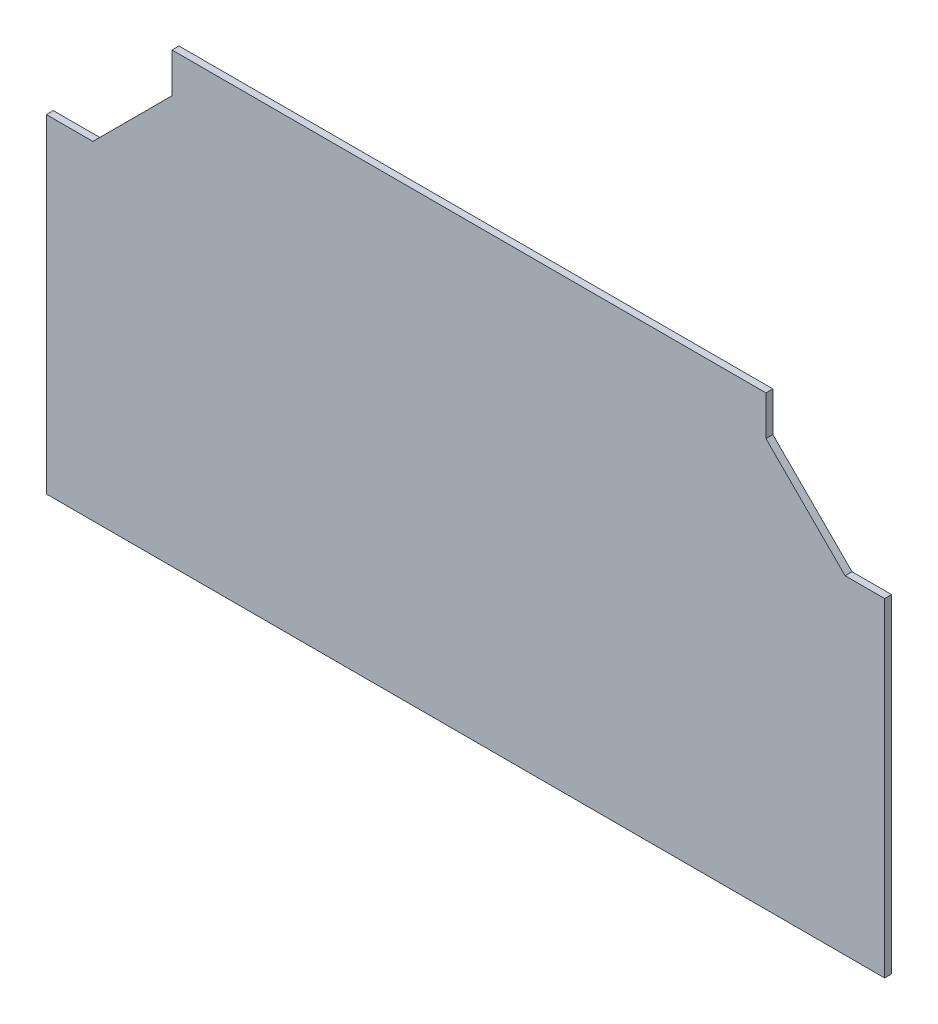
ISO-10303-21;
HEADER;
FILE_DESCRIPTION(('STEP AP214'),'2;1');
FILE_NAME('part.step','',(''),(''),'','','');
FILE_SCHEMA(('AUTOMOTIVE_DESIGN { 1 0 10303 214 1 1 1 1 }'));
ENDSEC;
DATA;
#1=APPLICATION_CONTEXT('core data for automotive mechanical design processes');
#2=APPLICATION_PROTOCOL_DEFINITION('international standard','automotive_design',2000,#1);
#3=PRODUCT_CONTEXT('',#1,'mechanical');
#4=PRODUCT('Part','Part','',(#3));
#5=PRODUCT_RELATED_PRODUCT_CATEGORY('part','',(#4));
#6=PRODUCT_DEFINITION_FORMATION('','',#4);
#7=PRODUCT_DEFINITION_CONTEXT('part definition',#1,'design');
#8=PRODUCT_DEFINITION('design','',#6,#7);
#9=PRODUCT_DEFINITION_SHAPE('','',#8);
#10=(LENGTH_UNIT() NAMED_UNIT(*) SI_UNIT(.MILLI.,.METRE.));
#11=(NAMED_UNIT(*) PLANE_ANGLE_UNIT() SI_UNIT($,.RADIAN.));
#12=(NAMED_UNIT(*) SI_UNIT($,.STERADIAN.) SOLID_ANGLE_UNIT());
#13=UNCERTAINTY_MEASURE_WITH_UNIT(LENGTH_MEASURE(1.E-05),#10,'distance_accuracy_value','');
#14=(GEOMETRIC_REPRESENTATION_CONTEXT(3) GLOBAL_UNCERTAINTY_ASSIGNED_CONTEXT((#13)) GLOBAL_UNIT_ASSIGNED_CONTEXT((#10,
#11,#12)) REPRESENTATION_CONTEXT('',''));
#15=CARTESIAN_POINT('',(0.,0.,0.));
#16=DIRECTION('',(0.,0.,1.));
#17=DIRECTION('',(1.,0.,0.));
#18=AXIS2_PLACEMENT_3D('',#15,#16,#17);
#19=CARTESIAN_POINT('',(-423.5,0.,3.5));
#20=DIRECTION('',(1.,0.,0.));
#21=DIRECTION('',(0.,0.,-1.));
#22=AXIS2_PLACEMENT_3D('',#19,#20,#21);
#23=PLANE('',#22);
#24=DIRECTION('',(0.,-1.,0.));
#25=VECTOR('',#24,1.);
#26=CARTESIAN_POINT('',(-423.5,0.,0.));
#27=LINE('',#26,#25);
#28=CARTESIAN_POINT('',(-423.5,166.,0.));
#29=VERTEX_POINT('',#28);
#30=CARTESIAN_POINT('',(-423.5,0.,0.));
#31=VERTEX_POINT('',#30);
#32=EDGE_CURVE('E141',#29,#31,#27,.T.);
#33=ORIENTED_EDGE('',*,*,#32,.T.);
#34=DIRECTION('',(0.,0.,-1.));
#35=VECTOR('',#34,1.);
#36=CARTESIAN_POINT('',(-423.5,0.,3.5));
#37=LINE('',#36,#35);
#38=CARTESIAN_POINT('',(-423.5,0.,3.5));
#39=VERTEX_POINT('',#38);
#40=EDGE_CURVE('E11',#39,#31,#37,.T.);
#41=ORIENTED_EDGE('',*,*,#40,.F.);
#42=DIRECTION('',(0.,-1.,0.));
#43=VECTOR('',#42,1.);
#44=CARTESIAN_POINT('',(-423.5,0.,3.5));
#45=LINE('',#44,#43);
#46=CARTESIAN_POINT('',(-423.5,166.,3.5));
#47=VERTEX_POINT('',#46);
#48=EDGE_CURVE('E160',#47,#39,#45,.T.);
#49=ORIENTED_EDGE('',*,*,#48,.F.);
#50=DIRECTION('',(0.,0.,-1.));
#51=VECTOR('',#50,1.);
#52=CARTESIAN_POINT('',(-423.5,166.,3.5));
#53=LINE('',#52,#51);
#54=EDGE_CURVE('E137',#47,#29,#53,.T.);
#55=ORIENTED_EDGE('',*,*,#54,.T.);
#56=EDGE_LOOP('',(#33,#41,#49,#55));
#57=FACE_BOUND('',#56,.T.);
#58=ADVANCED_FACE('F33',(#57),#23,.F.);
#59=CARTESIAN_POINT('',(-59.9999999999988,2.74806958195364E-13,3.5));
#60=DIRECTION('',(0.,1.,0.));
#61=DIRECTION('',(-1.,0.,0.));
#62=AXIS2_PLACEMENT_3D('',#59,#60,#61);
#63=PLANE('',#62);
#64=DIRECTION('',(1.,0.,0.));
#65=VECTOR('',#64,1.);
#66=CARTESIAN_POINT('',(-59.9999999999988,2.74806958195364E-13,0.));
#67=LINE('',#66,#65);
#68=CARTESIAN_POINT('',(0.,0.,0.));
#69=VERTEX_POINT('',#68);
#70=EDGE_CURVE('E144',#31,#69,#67,.T.);
#71=ORIENTED_EDGE('',*,*,#70,.T.);
#72=DIRECTION('',(0.,0.,-1.));
#73=VECTOR('',#72,1.);
#74=CARTESIAN_POINT('',(0.,0.,3.5));
#75=LINE('',#74,#73);
#76=CARTESIAN_POINT('',(0.,0.,3.5));
#77=VERTEX_POINT('',#76);
#78=EDGE_CURVE('E41',#77,#69,#75,.T.);
#79=ORIENTED_EDGE('',*,*,#78,.F.);
#80=DIRECTION('',(1.,3.02286688003802E-13,0.));
#81=VECTOR('',#80,1.);
#82=CARTESIAN_POINT('',(-420.000000000009,1.00613961606655E-12,3.5));
#83=LINE('',#82,#81);
#84=EDGE_CURVE('E98',#39,#77,#83,.T.);
#85=ORIENTED_EDGE('',*,*,#84,.F.);
#86=ORIENTED_EDGE('',*,*,#40,.T.);
#87=EDGE_LOOP('',(#71,#79,#85,#86));
#88=FACE_BOUND('',#87,.T.);
#89=ADVANCED_FACE('F181',(#88),#63,.F.);
#90=CARTESIAN_POINT('',(1.22455880881257E-12,6.00000000000029,3.5));
#91=DIRECTION('',(-1.,0.,0.));
#92=DIRECTION('',(0.,-1.,0.));
#93=AXIS2_PLACEMENT_3D('',#90,#91,#92);
#94=PLANE('',#93);
#95=DIRECTION('',(0.,1.,0.));
#96=VECTOR('',#95,1.);
#97=CARTESIAN_POINT('',(1.22455880881257E-12,6.00000000000029,0.));
#98=LINE('',#97,#96);
#99=CARTESIAN_POINT('',(0.,166.,0.));
#100=VERTEX_POINT('',#99);
#101=EDGE_CURVE('E147',#69,#100,#98,.T.);
#102=ORIENTED_EDGE('',*,*,#101,.T.);
#103=DIRECTION('',(0.,0.,-1.));
#104=VECTOR('',#103,1.);
#105=CARTESIAN_POINT('',(0.,166.,3.5));
#106=LINE('',#105,#104);
#107=CARTESIAN_POINT('',(0.,166.,3.5));
#108=VERTEX_POINT('',#107);
#109=EDGE_CURVE('E173',#108,#100,#106,.T.);
#110=ORIENTED_EDGE('',*,*,#109,.F.);
#111=DIRECTION('',(2.04093134802085E-13,1.,0.));
#112=VECTOR('',#111,1.);
#113=CARTESIAN_POINT('',(0.,0.,3.5));
#114=LINE('',#113,#112);
#115=EDGE_CURVE('E180',#77,#108,#114,.T.);
#116=ORIENTED_EDGE('',*,*,#115,.F.);
#117=ORIENTED_EDGE('',*,*,#78,.T.);
#118=EDGE_LOOP('',(#102,#110,#116,#117));
#119=FACE_BOUND('',#118,.T.);
#120=ADVANCED_FACE('F178',(#119),#94,.F.);
#121=CARTESIAN_POINT('',(0.,166.,3.5));
#122=DIRECTION('',(0.,-1.,0.));
#123=DIRECTION('',(0.,0.,-1.));
#124=AXIS2_PLACEMENT_3D('',#121,#122,#123);
#125=PLANE('',#124);
#126=DIRECTION('',(-1.,0.,0.));
#127=VECTOR('',#126,1.);
#128=CARTESIAN_POINT('',(0.,166.,0.));
#129=LINE('',#128,#127);
#130=CARTESIAN_POINT('',(-20.,166.,0.));
#131=VERTEX_POINT('',#130);
#132=EDGE_CURVE('E149',#100,#131,#129,.T.);
#133=ORIENTED_EDGE('',*,*,#132,.T.);
#134=DIRECTION('',(0.,0.,-1.));
#135=VECTOR('',#134,1.);
#136=CARTESIAN_POINT('',(-20.,166.,3.5));
#137=LINE('',#136,#135);
#138=CARTESIAN_POINT('',(-20.,166.,3.5));
#139=VERTEX_POINT('',#138);
#140=EDGE_CURVE('E170',#139,#131,#137,.T.);
#141=ORIENTED_EDGE('',*,*,#140,.F.);
#142=DIRECTION('',(-1.,0.,0.));
#143=VECTOR('',#142,1.);
#144=CARTESIAN_POINT('',(0.,166.,3.5));
#145=LINE('',#144,#143);
#146=EDGE_CURVE('E200',#108,#139,#145,.T.);
#147=ORIENTED_EDGE('',*,*,#146,.F.);
#148=ORIENTED_EDGE('',*,*,#109,.T.);
#149=EDGE_LOOP('',(#133,#141,#147,#148));
#150=FACE_BOUND('',#149,.T.);
#151=ADVANCED_FACE('F191',(#150),#125,.F.);
#152=CARTESIAN_POINT('',(-20.,166.,3.5));
#153=DIRECTION('',(-0.707106781186547,-0.707106781186548,0.));
#154=DIRECTION('',(0.707106781186548,-0.707106781186547,0.));
#155=AXIS2_PLACEMENT_3D('',#152,#153,#154);
#156=PLANE('',#155);
#157=DIRECTION('',(-0.707106781186548,0.707106781186547,0.));
#158=VECTOR('',#157,1.);
#159=CARTESIAN_POINT('',(-20.,166.,0.));
#160=LINE('',#159,#158);
#161=CARTESIAN_POINT('',(-60.,206.,0.));
#162=VERTEX_POINT('',#161);
#163=EDGE_CURVE('E151',#131,#162,#160,.T.);
#164=ORIENTED_EDGE('',*,*,#163,.T.);
#165=DIRECTION('',(0.,0.,-1.));
#166=VECTOR('',#165,1.);
#167=CARTESIAN_POINT('',(-60.,206.,3.5));
#168=LINE('',#167,#166);
#169=CARTESIAN_POINT('',(-60.,206.,3.5));
#170=VERTEX_POINT('',#169);
#171=EDGE_CURVE('E167',#170,#162,#168,.T.);
#172=ORIENTED_EDGE('',*,*,#171,.F.);
#173=DIRECTION('',(-0.707106781186548,0.707106781186547,0.));
#174=VECTOR('',#173,1.);
#175=CARTESIAN_POINT('',(-20.,166.,3.5));
#176=LINE('',#175,#174);
#177=EDGE_CURVE('E197',#139,#170,#176,.T.);
#178=ORIENTED_EDGE('',*,*,#177,.F.);
#179=ORIENTED_EDGE('',*,*,#140,.T.);
#180=EDGE_LOOP('',(#164,#172,#178,#179));
#181=FACE_BOUND('',#180,.T.);
#182=ADVANCED_FACE('F195',(#181),#156,.F.);
#183=CARTESIAN_POINT('',(-60.,206.,3.5));
#184=DIRECTION('',(-1.,0.,0.));
#185=DIRECTION('',(0.,0.,1.));
#186=AXIS2_PLACEMENT_3D('',#183,#184,#185);
#187=PLANE('',#186);
#188=DIRECTION('',(0.,1.,0.));
#189=VECTOR('',#188,1.);
#190=CARTESIAN_POINT('',(-60.,206.,0.));
#191=LINE('',#190,#189);
#192=CARTESIAN_POINT('',(-60.,226.,0.));
#193=VERTEX_POINT('',#192);
#194=EDGE_CURVE('E153',#162,#193,#191,.T.);
#195=ORIENTED_EDGE('',*,*,#194,.T.);
#196=DIRECTION('',(0.,0.,-1.));
#197=VECTOR('',#196,1.);
#198=CARTESIAN_POINT('',(-60.,226.,3.5));
#199=LINE('',#198,#197);
#200=CARTESIAN_POINT('',(-60.,226.,3.5));
#201=VERTEX_POINT('',#200);
#202=EDGE_CURVE('E164',#201,#193,#199,.T.);
#203=ORIENTED_EDGE('',*,*,#202,.F.);
#204=DIRECTION('',(0.,1.,0.));
#205=VECTOR('',#204,1.);
#206=CARTESIAN_POINT('',(-60.,206.,3.5));
#207=LINE('',#206,#205);
#208=EDGE_CURVE('E199',#170,#201,#207,.T.);
#209=ORIENTED_EDGE('',*,*,#208,.F.);
#210=ORIENTED_EDGE('',*,*,#171,.T.);
#211=EDGE_LOOP('',(#195,#203,#209,#210));
#212=FACE_BOUND('',#211,.T.);
#213=ADVANCED_FACE('F215',(#212),#187,.F.);
#214=CARTESIAN_POINT('',(-60.,226.,3.5));
#215=DIRECTION('',(0.,-1.,0.));
#216=DIRECTION('',(1.,0.,0.));
#217=AXIS2_PLACEMENT_3D('',#214,#215,#216);
#218=PLANE('',#217);
#219=DIRECTION('',(-1.,0.,0.));
#220=VECTOR('',#219,1.);
#221=CARTESIAN_POINT('',(-60.,226.,0.));
#222=LINE('',#221,#220);
#223=CARTESIAN_POINT('',(-360.,226.,0.));
#224=VERTEX_POINT('',#223);
#225=EDGE_CURVE('E155',#193,#224,#222,.T.);
#226=ORIENTED_EDGE('',*,*,#225,.T.);
#227=DIRECTION('',(0.,0.,-1.));
#228=VECTOR('',#227,1.);
#229=CARTESIAN_POINT('',(-360.,226.,3.5));
#230=LINE('',#229,#228);
#231=CARTESIAN_POINT('',(-360.,226.,3.5));
#232=VERTEX_POINT('',#231);
#233=EDGE_CURVE('E132',#232,#224,#230,.T.);
#234=ORIENTED_EDGE('',*,*,#233,.F.);
#235=DIRECTION('',(-1.,0.,0.));
#236=VECTOR('',#235,1.);
#237=CARTESIAN_POINT('',(-60.,226.,3.5));
#238=LINE('',#237,#236);
#239=EDGE_CURVE('E123',#201,#232,#238,.T.);
#240=ORIENTED_EDGE('',*,*,#239,.F.);
#241=ORIENTED_EDGE('',*,*,#202,.T.);
#242=EDGE_LOOP('',(#226,#234,#240,#241));
#243=FACE_BOUND('',#242,.T.);
#244=ADVANCED_FACE('F212',(#243),#218,.F.);
#245=CARTESIAN_POINT('',(-360.,205.999999999999,3.5));
#246=DIRECTION('',(1.,0.,0.));
#247=DIRECTION('',(0.,1.,0.));
#248=AXIS2_PLACEMENT_3D('',#245,#246,#247);
#249=PLANE('',#248);
#250=DIRECTION('',(0.,-1.,0.));
#251=VECTOR('',#250,1.);
#252=CARTESIAN_POINT('',(-360.,205.999999999999,0.));
#253=LINE('',#252,#251);
#254=CARTESIAN_POINT('',(-360.,205.999999999999,0.));
#255=VERTEX_POINT('',#254);
#256=EDGE_CURVE('E131',#224,#255,#253,.T.);
#257=ORIENTED_EDGE('',*,*,#256,.T.);
#258=DIRECTION('',(0.,0.,-1.));
#259=VECTOR('',#258,1.);
#260=CARTESIAN_POINT('',(-360.,205.999999999999,3.5));
#261=LINE('',#260,#259);
#262=CARTESIAN_POINT('',(-360.,205.999999999999,3.5));
#263=VERTEX_POINT('',#262);
#264=EDGE_CURVE('E128',#263,#255,#261,.T.);
#265=ORIENTED_EDGE('',*,*,#264,.F.);
#266=DIRECTION('',(0.,-1.,0.));
#267=VECTOR('',#266,1.);
#268=CARTESIAN_POINT('',(-360.,205.999999999999,3.5));
#269=LINE('',#268,#267);
#270=EDGE_CURVE('E117',#232,#263,#269,.T.);
#271=ORIENTED_EDGE('',*,*,#270,.F.);
#272=ORIENTED_EDGE('',*,*,#233,.T.);
#273=EDGE_LOOP('',(#257,#265,#271,#272));
#274=FACE_BOUND('',#273,.T.);
#275=ADVANCED_FACE('F129',(#274),#249,.F.);
#276=CARTESIAN_POINT('',(-400.,166.,3.5));
#277=DIRECTION('',(0.707106781186543,-0.707106781186552,0.));
#278=DIRECTION('',(0.707106781186552,0.707106781186543,0.));
#279=AXIS2_PLACEMENT_3D('',#276,#277,#278);
#280=PLANE('',#279);
#281=DIRECTION('',(-0.707106781186552,-0.707106781186543,0.));
#282=VECTOR('',#281,1.);
#283=CARTESIAN_POINT('',(-400.,166.,0.));
#284=LINE('',#283,#282);
#285=CARTESIAN_POINT('',(-400.,166.,0.));
#286=VERTEX_POINT('',#285);
#287=EDGE_CURVE('E84',#255,#286,#284,.T.);
#288=ORIENTED_EDGE('',*,*,#287,.T.);
#289=DIRECTION('',(0.,0.,-1.));
#290=VECTOR('',#289,1.);
#291=CARTESIAN_POINT('',(-400.,166.,3.5));
#292=LINE('',#291,#290);
#293=CARTESIAN_POINT('',(-400.,166.,3.5));
#294=VERTEX_POINT('',#293);
#295=EDGE_CURVE('E133',#294,#286,#292,.T.);
#296=ORIENTED_EDGE('',*,*,#295,.F.);
#297=DIRECTION('',(-0.707106781186552,-0.707106781186543,0.));
#298=VECTOR('',#297,1.);
#299=CARTESIAN_POINT('',(-400.,166.,3.5));
#300=LINE('',#299,#298);
#301=EDGE_CURVE('E121',#263,#294,#300,.T.);
#302=ORIENTED_EDGE('',*,*,#301,.F.);
#303=ORIENTED_EDGE('',*,*,#264,.T.);
#304=EDGE_LOOP('',(#288,#296,#302,#303));
#305=FACE_BOUND('',#304,.T.);
#306=ADVANCED_FACE('F135',(#305),#280,.F.);
#307=CARTESIAN_POINT('',(-400.,166.,3.5));
#308=DIRECTION('',(0.,-1.,0.));
#309=DIRECTION('',(1.,0.,0.));
#310=AXIS2_PLACEMENT_3D('',#307,#308,#309);
#311=PLANE('',#310);
#312=DIRECTION('',(-1.,0.,0.));
#313=VECTOR('',#312,1.);
#314=CARTESIAN_POINT('',(-400.,166.,0.));
#315=LINE('',#314,#313);
#316=EDGE_CURVE('E90',#286,#29,#315,.T.);
#317=ORIENTED_EDGE('',*,*,#316,.T.);
#318=ORIENTED_EDGE('',*,*,#54,.F.);
#319=DIRECTION('',(-1.,0.,0.));
#320=VECTOR('',#319,1.);
#321=CARTESIAN_POINT('',(-400.,166.,3.5));
#322=LINE('',#321,#320);
#323=EDGE_CURVE('E49',#294,#47,#322,.T.);
#324=ORIENTED_EDGE('',*,*,#323,.F.);
#325=ORIENTED_EDGE('',*,*,#295,.T.);
#326=EDGE_LOOP('',(#317,#318,#324,#325));
#327=FACE_BOUND('',#326,.T.);
#328=ADVANCED_FACE('F209',(#327),#311,.F.);
#329=CARTESIAN_POINT('',(0.,0.,3.5));
#330=DIRECTION('',(0.,0.,1.));
#331=DIRECTION('',(1.,0.,0.));
#332=AXIS2_PLACEMENT_3D('',#329,#330,#331);
#333=PLANE('',#332);
#334=ORIENTED_EDGE('',*,*,#48,.T.);
#335=ORIENTED_EDGE('',*,*,#84,.T.);
#336=ORIENTED_EDGE('',*,*,#115,.T.);
#337=ORIENTED_EDGE('',*,*,#146,.T.);
#338=ORIENTED_EDGE('',*,*,#177,.T.);
#339=ORIENTED_EDGE('',*,*,#208,.T.);
#340=ORIENTED_EDGE('',*,*,#239,.T.);
#341=ORIENTED_EDGE('',*,*,#270,.T.);
#342=ORIENTED_EDGE('',*,*,#301,.T.);
#343=ORIENTED_EDGE('',*,*,#323,.T.);
#344=EDGE_LOOP('',(#334,#335,#336,#337,#338,#339,#340,#341,#342,#343));
#345=FACE_BOUND('',#344,.T.);
#346=ADVANCED_FACE('F119',(#345),#333,.T.);
#347=CARTESIAN_POINT('',(0.,0.,0.));
#348=DIRECTION('',(0.,0.,1.));
#349=DIRECTION('',(1.,0.,0.));
#350=AXIS2_PLACEMENT_3D('',#347,#348,#349);
#351=PLANE('',#350);
#352=ORIENTED_EDGE('',*,*,#32,.F.);
#353=ORIENTED_EDGE('',*,*,#316,.F.);
#354=ORIENTED_EDGE('',*,*,#287,.F.);
#355=ORIENTED_EDGE('',*,*,#256,.F.);
#356=ORIENTED_EDGE('',*,*,#225,.F.);
#357=ORIENTED_EDGE('',*,*,#194,.F.);
#358=ORIENTED_EDGE('',*,*,#163,.F.);
#359=ORIENTED_EDGE('',*,*,#132,.F.);
#360=ORIENTED_EDGE('',*,*,#101,.F.);
#361=ORIENTED_EDGE('',*,*,#70,.F.);
#362=EDGE_LOOP('',(#352,#353,#354,#355,#356,#357,#358,#359,#360,#361));
#363=FACE_BOUND('',#362,.T.);
#364=ADVANCED_FACE('F185',(#363),#351,.F.);
#365=CLOSED_SHELL('',(#58,#89,#120,#151,#182,#213,#244,#275,#306,#328,#346,#364));
#366=MANIFOLD_SOLID_BREP('B2',#365);
#367=ADVANCED_BREP_SHAPE_REPRESENTATION('',(#18,#366),#14);
#368=SHAPE_DEFINITION_REPRESENTATION(#9,#367);
ENDSEC;
END-ISO-10303-21;
